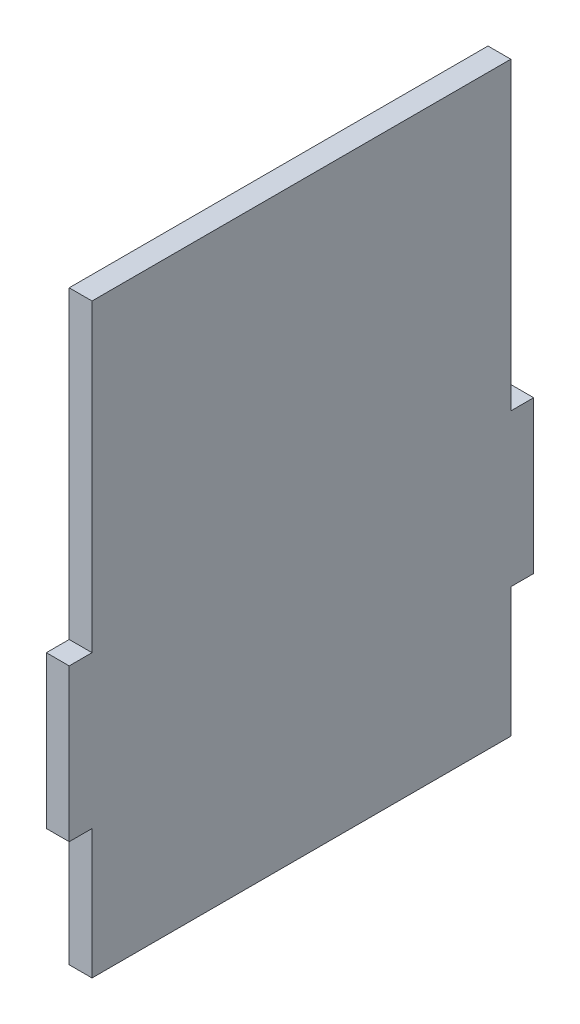
ISO-10303-21;
HEADER;
FILE_DESCRIPTION(('STEP AP214'),'2;1');
FILE_NAME('part.step','',(''),(''),'','','');
FILE_SCHEMA(('AUTOMOTIVE_DESIGN { 1 0 10303 214 1 1 1 1 }'));
ENDSEC;
DATA;
#1=APPLICATION_CONTEXT('core data for automotive mechanical design processes');
#2=APPLICATION_PROTOCOL_DEFINITION('international standard','automotive_design',2000,#1);
#3=PRODUCT_CONTEXT('',#1,'mechanical');
#4=PRODUCT('Part','Part','',(#3));
#5=PRODUCT_RELATED_PRODUCT_CATEGORY('part','',(#4));
#6=PRODUCT_DEFINITION_FORMATION('','',#4);
#7=PRODUCT_DEFINITION_CONTEXT('part definition',#1,'design');
#8=PRODUCT_DEFINITION('design','',#6,#7);
#9=PRODUCT_DEFINITION_SHAPE('','',#8);
#10=(LENGTH_UNIT() NAMED_UNIT(*) SI_UNIT(.MILLI.,.METRE.));
#11=(NAMED_UNIT(*) PLANE_ANGLE_UNIT() SI_UNIT($,.RADIAN.));
#12=(NAMED_UNIT(*) SI_UNIT($,.STERADIAN.) SOLID_ANGLE_UNIT());
#13=UNCERTAINTY_MEASURE_WITH_UNIT(LENGTH_MEASURE(1.E-05),#10,'distance_accuracy_value','');
#14=(GEOMETRIC_REPRESENTATION_CONTEXT(3) GLOBAL_UNCERTAINTY_ASSIGNED_CONTEXT((#13)) GLOBAL_UNIT_ASSIGNED_CONTEXT((#10,
#11,#12)) REPRESENTATION_CONTEXT('',''));
#15=CARTESIAN_POINT('',(0.,0.,0.));
#16=DIRECTION('',(0.,0.,1.));
#17=DIRECTION('',(1.,0.,0.));
#18=AXIS2_PLACEMENT_3D('',#15,#16,#17);
#19=CARTESIAN_POINT('',(3.,0.,-27.5));
#20=DIRECTION('',(0.,0.,1.));
#21=DIRECTION('',(1.,0.,0.));
#22=AXIS2_PLACEMENT_3D('',#19,#20,#21);
#23=PLANE('',#22);
#24=DIRECTION('',(0.,1.,0.));
#25=VECTOR('',#24,1.);
#26=CARTESIAN_POINT('',(0.,0.,-27.5));
#27=LINE('',#26,#25);
#28=CARTESIAN_POINT('',(0.,0.,-27.5));
#29=VERTEX_POINT('',#28);
#30=CARTESIAN_POINT('',(0.,17.,-27.5));
#31=VERTEX_POINT('',#30);
#32=EDGE_CURVE('E154',#29,#31,#27,.T.);
#33=ORIENTED_EDGE('',*,*,#32,.T.);
#34=DIRECTION('',(-1.,0.,0.));
#35=VECTOR('',#34,1.);
#36=CARTESIAN_POINT('',(3.,17.,-27.5));
#37=LINE('',#36,#35);
#38=CARTESIAN_POINT('',(3.,17.,-27.5));
#39=VERTEX_POINT('',#38);
#40=EDGE_CURVE('E11',#39,#31,#37,.T.);
#41=ORIENTED_EDGE('',*,*,#40,.F.);
#42=DIRECTION('',(0.,1.,0.));
#43=VECTOR('',#42,1.);
#44=CARTESIAN_POINT('',(3.,0.,-27.5));
#45=LINE('',#44,#43);
#46=CARTESIAN_POINT('',(3.,0.,-27.5));
#47=VERTEX_POINT('',#46);
#48=EDGE_CURVE('E176',#47,#39,#45,.T.);
#49=ORIENTED_EDGE('',*,*,#48,.F.);
#50=DIRECTION('',(-1.,0.,0.));
#51=VECTOR('',#50,1.);
#52=CARTESIAN_POINT('',(3.,0.,-27.5));
#53=LINE('',#52,#51);
#54=EDGE_CURVE('E150',#47,#29,#53,.T.);
#55=ORIENTED_EDGE('',*,*,#54,.T.);
#56=EDGE_LOOP('',(#33,#41,#49,#55));
#57=FACE_BOUND('',#56,.T.);
#58=ADVANCED_FACE('F34',(#57),#23,.F.);
#59=CARTESIAN_POINT('',(3.,17.,-27.5));
#60=DIRECTION('',(0.,1.,0.));
#61=DIRECTION('',(0.,0.,1.));
#62=AXIS2_PLACEMENT_3D('',#59,#60,#61);
#63=PLANE('',#62);
#64=DIRECTION('',(0.,0.,-1.));
#65=VECTOR('',#64,1.);
#66=CARTESIAN_POINT('',(0.,17.,-27.5));
#67=LINE('',#66,#65);
#68=CARTESIAN_POINT('',(0.,17.,-30.5));
#69=VERTEX_POINT('',#68);
#70=EDGE_CURVE('E157',#31,#69,#67,.T.);
#71=ORIENTED_EDGE('',*,*,#70,.T.);
#72=DIRECTION('',(-1.,0.,0.));
#73=VECTOR('',#72,1.);
#74=CARTESIAN_POINT('',(3.,17.,-30.5));
#75=LINE('',#74,#73);
#76=CARTESIAN_POINT('',(3.,17.,-30.5));
#77=VERTEX_POINT('',#76);
#78=EDGE_CURVE('E42',#77,#69,#75,.T.);
#79=ORIENTED_EDGE('',*,*,#78,.F.);
#80=DIRECTION('',(0.,0.,-1.));
#81=VECTOR('',#80,1.);
#82=CARTESIAN_POINT('',(3.,17.,-27.5));
#83=LINE('',#82,#81);
#84=EDGE_CURVE('E105',#39,#77,#83,.T.);
#85=ORIENTED_EDGE('',*,*,#84,.F.);
#86=ORIENTED_EDGE('',*,*,#40,.T.);
#87=EDGE_LOOP('',(#71,#79,#85,#86));
#88=FACE_BOUND('',#87,.T.);
#89=ADVANCED_FACE('F254',(#88),#63,.F.);
#90=CARTESIAN_POINT('',(3.,17.,-30.5));
#91=DIRECTION('',(0.,0.,1.));
#92=DIRECTION('',(1.,0.,0.));
#93=AXIS2_PLACEMENT_3D('',#90,#91,#92);
#94=PLANE('',#93);
#95=DIRECTION('',(0.,1.,0.));
#96=VECTOR('',#95,1.);
#97=CARTESIAN_POINT('',(0.,17.,-30.5));
#98=LINE('',#97,#96);
#99=CARTESIAN_POINT('',(0.,37.,-30.5));
#100=VERTEX_POINT('',#99);
#101=EDGE_CURVE('E159',#69,#100,#98,.T.);
#102=ORIENTED_EDGE('',*,*,#101,.T.);
#103=DIRECTION('',(-1.,0.,0.));
#104=VECTOR('',#103,1.);
#105=CARTESIAN_POINT('',(3.,37.,-30.5));
#106=LINE('',#105,#104);
#107=CARTESIAN_POINT('',(3.,37.,-30.5));
#108=VERTEX_POINT('',#107);
#109=EDGE_CURVE('E195',#108,#100,#106,.T.);
#110=ORIENTED_EDGE('',*,*,#109,.F.);
#111=DIRECTION('',(0.,1.,0.));
#112=VECTOR('',#111,1.);
#113=CARTESIAN_POINT('',(3.,17.,-30.5));
#114=LINE('',#113,#112);
#115=EDGE_CURVE('E203',#77,#108,#114,.T.);
#116=ORIENTED_EDGE('',*,*,#115,.F.);
#117=ORIENTED_EDGE('',*,*,#78,.T.);
#118=EDGE_LOOP('',(#102,#110,#116,#117));
#119=FACE_BOUND('',#118,.T.);
#120=ADVANCED_FACE('F201',(#119),#94,.F.);
#121=CARTESIAN_POINT('',(3.,37.,-30.5));
#122=DIRECTION('',(0.,-1.,0.));
#123=DIRECTION('',(0.,0.,-1.));
#124=AXIS2_PLACEMENT_3D('',#121,#122,#123);
#125=PLANE('',#124);
#126=DIRECTION('',(0.,0.,1.));
#127=VECTOR('',#126,1.);
#128=CARTESIAN_POINT('',(0.,37.,-30.5));
#129=LINE('',#128,#127);
#130=CARTESIAN_POINT('',(0.,37.,-27.5));
#131=VERTEX_POINT('',#130);
#132=EDGE_CURVE('E161',#100,#131,#129,.T.);
#133=ORIENTED_EDGE('',*,*,#132,.T.);
#134=DIRECTION('',(-1.,0.,0.));
#135=VECTOR('',#134,1.);
#136=CARTESIAN_POINT('',(3.,37.,-27.5));
#137=LINE('',#136,#135);
#138=CARTESIAN_POINT('',(3.,37.,-27.5));
#139=VERTEX_POINT('',#138);
#140=EDGE_CURVE('E192',#139,#131,#137,.T.);
#141=ORIENTED_EDGE('',*,*,#140,.F.);
#142=DIRECTION('',(0.,0.,1.));
#143=VECTOR('',#142,1.);
#144=CARTESIAN_POINT('',(3.,37.,-30.5));
#145=LINE('',#144,#143);
#146=EDGE_CURVE('E221',#108,#139,#145,.T.);
#147=ORIENTED_EDGE('',*,*,#146,.F.);
#148=ORIENTED_EDGE('',*,*,#109,.T.);
#149=EDGE_LOOP('',(#133,#141,#147,#148));
#150=FACE_BOUND('',#149,.T.);
#151=ADVANCED_FACE('F212',(#150),#125,.F.);
#152=CARTESIAN_POINT('',(3.,37.,-27.5));
#153=DIRECTION('',(0.,0.,1.));
#154=DIRECTION('',(0.,-1.,0.));
#155=AXIS2_PLACEMENT_3D('',#152,#153,#154);
#156=PLANE('',#155);
#157=DIRECTION('',(0.,1.,0.));
#158=VECTOR('',#157,1.);
#159=CARTESIAN_POINT('',(0.,37.,-27.5));
#160=LINE('',#159,#158);
#161=CARTESIAN_POINT('',(0.,77.,-27.5));
#162=VERTEX_POINT('',#161);
#163=EDGE_CURVE('E163',#131,#162,#160,.T.);
#164=ORIENTED_EDGE('',*,*,#163,.T.);
#165=DIRECTION('',(-1.,0.,0.));
#166=VECTOR('',#165,1.);
#167=CARTESIAN_POINT('',(3.,77.,-27.5));
#168=LINE('',#167,#166);
#169=CARTESIAN_POINT('',(3.,77.,-27.5));
#170=VERTEX_POINT('',#169);
#171=EDGE_CURVE('E189',#170,#162,#168,.T.);
#172=ORIENTED_EDGE('',*,*,#171,.F.);
#173=DIRECTION('',(0.,1.,0.));
#174=VECTOR('',#173,1.);
#175=CARTESIAN_POINT('',(3.,37.,-27.5));
#176=LINE('',#175,#174);
#177=EDGE_CURVE('E218',#139,#170,#176,.T.);
#178=ORIENTED_EDGE('',*,*,#177,.F.);
#179=ORIENTED_EDGE('',*,*,#140,.T.);
#180=EDGE_LOOP('',(#164,#172,#178,#179));
#181=FACE_BOUND('',#180,.T.);
#182=ADVANCED_FACE('F216',(#181),#156,.F.);
#183=CARTESIAN_POINT('',(3.,77.,-27.5));
#184=DIRECTION('',(0.,-1.,0.));
#185=DIRECTION('',(0.,0.,-1.));
#186=AXIS2_PLACEMENT_3D('',#183,#184,#185);
#187=PLANE('',#186);
#188=DIRECTION('',(0.,0.,1.));
#189=VECTOR('',#188,1.);
#190=CARTESIAN_POINT('',(0.,77.,-27.5));
#191=LINE('',#190,#189);
#192=CARTESIAN_POINT('',(0.,77.,27.5));
#193=VERTEX_POINT('',#192);
#194=EDGE_CURVE('E165',#162,#193,#191,.T.);
#195=ORIENTED_EDGE('',*,*,#194,.T.);
#196=DIRECTION('',(-1.,0.,0.));
#197=VECTOR('',#196,1.);
#198=CARTESIAN_POINT('',(3.,77.,27.5));
#199=LINE('',#198,#197);
#200=CARTESIAN_POINT('',(3.,77.,27.5));
#201=VERTEX_POINT('',#200);
#202=EDGE_CURVE('E186',#201,#193,#199,.T.);
#203=ORIENTED_EDGE('',*,*,#202,.F.);
#204=DIRECTION('',(0.,0.,1.));
#205=VECTOR('',#204,1.);
#206=CARTESIAN_POINT('',(3.,77.,-27.5));
#207=LINE('',#206,#205);
#208=EDGE_CURVE('E220',#170,#201,#207,.T.);
#209=ORIENTED_EDGE('',*,*,#208,.F.);
#210=ORIENTED_EDGE('',*,*,#171,.T.);
#211=EDGE_LOOP('',(#195,#203,#209,#210));
#212=FACE_BOUND('',#211,.T.);
#213=ADVANCED_FACE('F267',(#212),#187,.F.);
#214=CARTESIAN_POINT('',(3.,37.,27.5));
#215=DIRECTION('',(0.,0.,-1.));
#216=DIRECTION('',(0.,1.,0.));
#217=AXIS2_PLACEMENT_3D('',#214,#215,#216);
#218=PLANE('',#217);
#219=DIRECTION('',(0.,-1.,0.));
#220=VECTOR('',#219,1.);
#221=CARTESIAN_POINT('',(0.,37.,27.5));
#222=LINE('',#221,#220);
#223=CARTESIAN_POINT('',(0.,37.,27.5));
#224=VERTEX_POINT('',#223);
#225=EDGE_CURVE('E167',#193,#224,#222,.T.);
#226=ORIENTED_EDGE('',*,*,#225,.T.);
#227=DIRECTION('',(-1.,0.,0.));
#228=VECTOR('',#227,1.);
#229=CARTESIAN_POINT('',(3.,37.,27.5));
#230=LINE('',#229,#228);
#231=CARTESIAN_POINT('',(3.,37.,27.5));
#232=VERTEX_POINT('',#231);
#233=EDGE_CURVE('E183',#232,#224,#230,.T.);
#234=ORIENTED_EDGE('',*,*,#233,.F.);
#235=DIRECTION('',(0.,-1.,0.));
#236=VECTOR('',#235,1.);
#237=CARTESIAN_POINT('',(3.,37.,27.5));
#238=LINE('',#237,#236);
#239=EDGE_CURVE('E223',#201,#232,#238,.T.);
#240=ORIENTED_EDGE('',*,*,#239,.F.);
#241=ORIENTED_EDGE('',*,*,#202,.T.);
#242=EDGE_LOOP('',(#226,#234,#240,#241));
#243=FACE_BOUND('',#242,.T.);
#244=ADVANCED_FACE('F270',(#243),#218,.F.);
#245=CARTESIAN_POINT('',(3.,37.,30.5));
#246=DIRECTION('',(0.,-1.,0.));
#247=DIRECTION('',(0.,0.,-1.));
#248=AXIS2_PLACEMENT_3D('',#245,#246,#247);
#249=PLANE('',#248);
#250=DIRECTION('',(0.,0.,1.));
#251=VECTOR('',#250,1.);
#252=CARTESIAN_POINT('',(0.,37.,30.5));
#253=LINE('',#252,#251);
#254=CARTESIAN_POINT('',(0.,37.,30.5));
#255=VERTEX_POINT('',#254);
#256=EDGE_CURVE('E169',#224,#255,#253,.T.);
#257=ORIENTED_EDGE('',*,*,#256,.T.);
#258=DIRECTION('',(-1.,0.,0.));
#259=VECTOR('',#258,1.);
#260=CARTESIAN_POINT('',(3.,37.,30.5));
#261=LINE('',#260,#259);
#262=CARTESIAN_POINT('',(3.,37.,30.5));
#263=VERTEX_POINT('',#262);
#264=EDGE_CURVE('E180',#263,#255,#261,.T.);
#265=ORIENTED_EDGE('',*,*,#264,.F.);
#266=DIRECTION('',(0.,0.,1.));
#267=VECTOR('',#266,1.);
#268=CARTESIAN_POINT('',(3.,37.,30.5));
#269=LINE('',#268,#267);
#270=EDGE_CURVE('E229',#232,#263,#269,.T.);
#271=ORIENTED_EDGE('',*,*,#270,.F.);
#272=ORIENTED_EDGE('',*,*,#233,.T.);
#273=EDGE_LOOP('',(#257,#265,#271,#272));
#274=FACE_BOUND('',#273,.T.);
#275=ADVANCED_FACE('F235',(#274),#249,.F.);
#276=CARTESIAN_POINT('',(3.,17.,30.5));
#277=DIRECTION('',(0.,0.,-1.));
#278=DIRECTION('',(-1.,0.,0.));
#279=AXIS2_PLACEMENT_3D('',#276,#277,#278);
#280=PLANE('',#279);
#281=DIRECTION('',(0.,-1.,0.));
#282=VECTOR('',#281,1.);
#283=CARTESIAN_POINT('',(0.,17.,30.5));
#284=LINE('',#283,#282);
#285=CARTESIAN_POINT('',(0.,17.,30.5));
#286=VERTEX_POINT('',#285);
#287=EDGE_CURVE('E171',#255,#286,#284,.T.);
#288=ORIENTED_EDGE('',*,*,#287,.T.);
#289=DIRECTION('',(-1.,0.,0.));
#290=VECTOR('',#289,1.);
#291=CARTESIAN_POINT('',(3.,17.,30.5));
#292=LINE('',#291,#290);
#293=CARTESIAN_POINT('',(3.,17.,30.5));
#294=VERTEX_POINT('',#293);
#295=EDGE_CURVE('E145',#294,#286,#292,.T.);
#296=ORIENTED_EDGE('',*,*,#295,.F.);
#297=DIRECTION('',(0.,-1.,0.));
#298=VECTOR('',#297,1.);
#299=CARTESIAN_POINT('',(3.,17.,30.5));
#300=LINE('',#299,#298);
#301=EDGE_CURVE('E136',#263,#294,#300,.T.);
#302=ORIENTED_EDGE('',*,*,#301,.F.);
#303=ORIENTED_EDGE('',*,*,#264,.T.);
#304=EDGE_LOOP('',(#288,#296,#302,#303));
#305=FACE_BOUND('',#304,.T.);
#306=ADVANCED_FACE('F239',(#305),#280,.F.);
#307=CARTESIAN_POINT('',(3.,17.,27.5));
#308=DIRECTION('',(0.,1.,0.));
#309=DIRECTION('',(0.,0.,1.));
#310=AXIS2_PLACEMENT_3D('',#307,#308,#309);
#311=PLANE('',#310);
#312=DIRECTION('',(0.,0.,-1.));
#313=VECTOR('',#312,1.);
#314=CARTESIAN_POINT('',(0.,17.,27.5));
#315=LINE('',#314,#313);
#316=CARTESIAN_POINT('',(0.,17.,27.5));
#317=VERTEX_POINT('',#316);
#318=EDGE_CURVE('E144',#286,#317,#315,.T.);
#319=ORIENTED_EDGE('',*,*,#318,.T.);
#320=DIRECTION('',(-1.,0.,0.));
#321=VECTOR('',#320,1.);
#322=CARTESIAN_POINT('',(3.,17.,27.5));
#323=LINE('',#322,#321);
#324=CARTESIAN_POINT('',(3.,17.,27.5));
#325=VERTEX_POINT('',#324);
#326=EDGE_CURVE('E141',#325,#317,#323,.T.);
#327=ORIENTED_EDGE('',*,*,#326,.F.);
#328=DIRECTION('',(0.,0.,-1.));
#329=VECTOR('',#328,1.);
#330=CARTESIAN_POINT('',(3.,17.,27.5));
#331=LINE('',#330,#329);
#332=EDGE_CURVE('E130',#294,#325,#331,.T.);
#333=ORIENTED_EDGE('',*,*,#332,.F.);
#334=ORIENTED_EDGE('',*,*,#295,.T.);
#335=EDGE_LOOP('',(#319,#327,#333,#334));
#336=FACE_BOUND('',#335,.T.);
#337=ADVANCED_FACE('F142',(#336),#311,.F.);
#338=CARTESIAN_POINT('',(3.,0.,27.5));
#339=DIRECTION('',(0.,0.,-1.));
#340=DIRECTION('',(0.,1.,0.));
#341=AXIS2_PLACEMENT_3D('',#338,#339,#340);
#342=PLANE('',#341);
#343=DIRECTION('',(0.,-1.,0.));
#344=VECTOR('',#343,1.);
#345=CARTESIAN_POINT('',(0.,0.,27.5));
#346=LINE('',#345,#344);
#347=CARTESIAN_POINT('',(0.,0.,27.5));
#348=VERTEX_POINT('',#347);
#349=EDGE_CURVE('E91',#317,#348,#346,.T.);
#350=ORIENTED_EDGE('',*,*,#349,.T.);
#351=DIRECTION('',(-1.,0.,0.));
#352=VECTOR('',#351,1.);
#353=CARTESIAN_POINT('',(3.,0.,27.5));
#354=LINE('',#353,#352);
#355=CARTESIAN_POINT('',(3.,0.,27.5));
#356=VERTEX_POINT('',#355);
#357=EDGE_CURVE('E146',#356,#348,#354,.T.);
#358=ORIENTED_EDGE('',*,*,#357,.F.);
#359=DIRECTION('',(0.,-1.,0.));
#360=VECTOR('',#359,1.);
#361=CARTESIAN_POINT('',(3.,0.,27.5));
#362=LINE('',#361,#360);
#363=EDGE_CURVE('E134',#325,#356,#362,.T.);
#364=ORIENTED_EDGE('',*,*,#363,.F.);
#365=ORIENTED_EDGE('',*,*,#326,.T.);
#366=EDGE_LOOP('',(#350,#358,#364,#365));
#367=FACE_BOUND('',#366,.T.);
#368=ADVANCED_FACE('F148',(#367),#342,.F.);
#369=CARTESIAN_POINT('',(3.,0.,27.5));
#370=DIRECTION('',(0.,1.,0.));
#371=DIRECTION('',(0.,0.,1.));
#372=AXIS2_PLACEMENT_3D('',#369,#370,#371);
#373=PLANE('',#372);
#374=DIRECTION('',(0.,0.,-1.));
#375=VECTOR('',#374,1.);
#376=CARTESIAN_POINT('',(0.,0.,27.5));
#377=LINE('',#376,#375);
#378=EDGE_CURVE('E97',#348,#29,#377,.T.);
#379=ORIENTED_EDGE('',*,*,#378,.T.);
#380=ORIENTED_EDGE('',*,*,#54,.F.);
#381=DIRECTION('',(0.,0.,-1.));
#382=VECTOR('',#381,1.);
#383=CARTESIAN_POINT('',(3.,0.,27.5));
#384=LINE('',#383,#382);
#385=EDGE_CURVE('E50',#356,#47,#384,.T.);
#386=ORIENTED_EDGE('',*,*,#385,.F.);
#387=ORIENTED_EDGE('',*,*,#357,.T.);
#388=EDGE_LOOP('',(#379,#380,#386,#387));
#389=FACE_BOUND('',#388,.T.);
#390=ADVANCED_FACE('F243',(#389),#373,.F.);
#391=CARTESIAN_POINT('',(3.,0.,0.));
#392=DIRECTION('',(-1.,0.,0.));
#393=DIRECTION('',(0.,0.,1.));
#394=AXIS2_PLACEMENT_3D('',#391,#392,#393);
#395=PLANE('',#394);
#396=ORIENTED_EDGE('',*,*,#48,.T.);
#397=ORIENTED_EDGE('',*,*,#84,.T.);
#398=ORIENTED_EDGE('',*,*,#115,.T.);
#399=ORIENTED_EDGE('',*,*,#146,.T.);
#400=ORIENTED_EDGE('',*,*,#177,.T.);
#401=ORIENTED_EDGE('',*,*,#208,.T.);
#402=ORIENTED_EDGE('',*,*,#239,.T.);
#403=ORIENTED_EDGE('',*,*,#270,.T.);
#404=ORIENTED_EDGE('',*,*,#301,.T.);
#405=ORIENTED_EDGE('',*,*,#332,.T.);
#406=ORIENTED_EDGE('',*,*,#363,.T.);
#407=ORIENTED_EDGE('',*,*,#385,.T.);
#408=EDGE_LOOP('',(#396,#397,#398,#399,#400,#401,#402,#403,#404,#405,#406,#407));
#409=FACE_BOUND('',#408,.T.);
#410=ADVANCED_FACE('F132',(#409),#395,.F.);
#411=CARTESIAN_POINT('',(0.,0.,0.));
#412=DIRECTION('',(-1.,0.,0.));
#413=DIRECTION('',(0.,0.,1.));
#414=AXIS2_PLACEMENT_3D('',#411,#412,#413);
#415=PLANE('',#414);
#416=ORIENTED_EDGE('',*,*,#32,.F.);
#417=ORIENTED_EDGE('',*,*,#378,.F.);
#418=ORIENTED_EDGE('',*,*,#349,.F.);
#419=ORIENTED_EDGE('',*,*,#318,.F.);
#420=ORIENTED_EDGE('',*,*,#287,.F.);
#421=ORIENTED_EDGE('',*,*,#256,.F.);
#422=ORIENTED_EDGE('',*,*,#225,.F.);
#423=ORIENTED_EDGE('',*,*,#194,.F.);
#424=ORIENTED_EDGE('',*,*,#163,.F.);
#425=ORIENTED_EDGE('',*,*,#132,.F.);
#426=ORIENTED_EDGE('',*,*,#101,.F.);
#427=ORIENTED_EDGE('',*,*,#70,.F.);
#428=EDGE_LOOP('',(#416,#417,#418,#419,#420,#421,#422,#423,#424,#425,#426,#427));
#429=FACE_BOUND('',#428,.T.);
#430=ADVANCED_FACE('F207',(#429),#415,.T.);
#431=CLOSED_SHELL('',(#58,#89,#120,#151,#182,#213,#244,#275,#306,#337,#368,#390,#410,#430));
#432=MANIFOLD_SOLID_BREP('B2',#431);
#433=ADVANCED_BREP_SHAPE_REPRESENTATION('',(#18,#432),#14);
#434=SHAPE_DEFINITION_REPRESENTATION(#9,#433);
ENDSEC;
END-ISO-10303-21;
